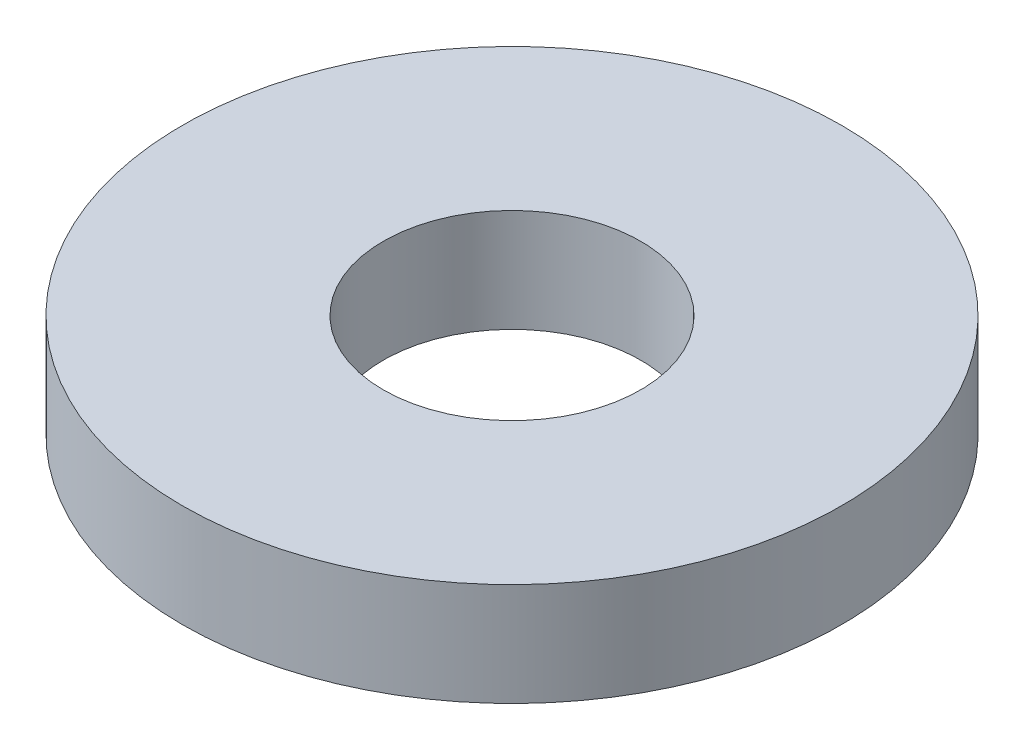
ISO-10303-21;
HEADER;
FILE_DESCRIPTION(('STEP AP214'),'2;1');
FILE_NAME('part.step','',(''),(''),'','','');
FILE_SCHEMA(('AUTOMOTIVE_DESIGN { 1 0 10303 214 1 1 1 1 }'));
ENDSEC;
DATA;
#1=APPLICATION_CONTEXT('core data for automotive mechanical design processes');
#2=APPLICATION_PROTOCOL_DEFINITION('international standard','automotive_design',2000,#1);
#3=PRODUCT_CONTEXT('',#1,'mechanical');
#4=PRODUCT('Part','Part','',(#3));
#5=PRODUCT_RELATED_PRODUCT_CATEGORY('part','',(#4));
#6=PRODUCT_DEFINITION_FORMATION('','',#4);
#7=PRODUCT_DEFINITION_CONTEXT('part definition',#1,'design');
#8=PRODUCT_DEFINITION('design','',#6,#7);
#9=PRODUCT_DEFINITION_SHAPE('','',#8);
#10=(LENGTH_UNIT() NAMED_UNIT(*) SI_UNIT(.MILLI.,.METRE.));
#11=(NAMED_UNIT(*) PLANE_ANGLE_UNIT() SI_UNIT($,.RADIAN.));
#12=(NAMED_UNIT(*) SI_UNIT($,.STERADIAN.) SOLID_ANGLE_UNIT());
#13=UNCERTAINTY_MEASURE_WITH_UNIT(LENGTH_MEASURE(1.E-05),#10,'distance_accuracy_value','');
#14=(GEOMETRIC_REPRESENTATION_CONTEXT(3) GLOBAL_UNCERTAINTY_ASSIGNED_CONTEXT((#13)) GLOBAL_UNIT_ASSIGNED_CONTEXT((#10,
#11,#12)) REPRESENTATION_CONTEXT('',''));
#15=CARTESIAN_POINT('',(0.,0.,0.));
#16=DIRECTION('',(0.,0.,1.));
#17=DIRECTION('',(1.,0.,0.));
#18=AXIS2_PLACEMENT_3D('',#15,#16,#17);
#19=CARTESIAN_POINT('',(0.,2.54,0.));
#20=DIRECTION('',(0.,1.,0.));
#21=DIRECTION('',(0.,0.,1.));
#22=AXIS2_PLACEMENT_3D('',#19,#20,#21);
#23=PLANE('',#22);
#24=CARTESIAN_POINT('',(0.,2.54,0.));
#25=DIRECTION('',(0.,1.,0.));
#26=DIRECTION('',(0.,0.,1.));
#27=AXIS2_PLACEMENT_3D('',#24,#25,#26);
#28=CIRCLE('',#27,8.128);
#29=CARTESIAN_POINT('',(0.,2.54,8.128));
#30=VERTEX_POINT('',#29);
#31=EDGE_CURVE('E10',#30,#30,#28,.T.);
#32=ORIENTED_EDGE('',*,*,#31,.T.);
#33=EDGE_LOOP('',(#32));
#34=FACE_BOUND('',#33,.T.);
#35=CARTESIAN_POINT('',(0.,2.54,0.));
#36=DIRECTION('',(0.,1.,0.));
#37=DIRECTION('',(0.,0.,1.));
#38=AXIS2_PLACEMENT_3D('',#35,#36,#37);
#39=CIRCLE('',#38,3.175);
#40=CARTESIAN_POINT('',(0.,2.54,3.175));
#41=VERTEX_POINT('',#40);
#42=EDGE_CURVE('E48',#41,#41,#39,.T.);
#43=ORIENTED_EDGE('',*,*,#42,.F.);
#44=EDGE_LOOP('',(#43));
#45=FACE_BOUND('',#44,.T.);
#46=ADVANCED_FACE('F35',(#34,#45),#23,.T.);
#47=CARTESIAN_POINT('',(0.,0.,0.));
#48=DIRECTION('',(0.,1.,0.));
#49=DIRECTION('',(0.,0.,1.));
#50=AXIS2_PLACEMENT_3D('',#47,#48,#49);
#51=PLANE('',#50);
#52=CARTESIAN_POINT('',(0.,0.,0.));
#53=DIRECTION('',(0.,1.,0.));
#54=DIRECTION('',(0.,0.,1.));
#55=AXIS2_PLACEMENT_3D('',#52,#53,#54);
#56=CIRCLE('',#55,8.128);
#57=CARTESIAN_POINT('',(0.,0.,8.128));
#58=VERTEX_POINT('',#57);
#59=EDGE_CURVE('E39',#58,#58,#56,.T.);
#60=ORIENTED_EDGE('',*,*,#59,.F.);
#61=EDGE_LOOP('',(#60));
#62=FACE_BOUND('',#61,.T.);
#63=CARTESIAN_POINT('',(0.,0.,0.));
#64=DIRECTION('',(0.,1.,0.));
#65=DIRECTION('',(0.,0.,1.));
#66=AXIS2_PLACEMENT_3D('',#63,#64,#65);
#67=CIRCLE('',#66,3.175);
#68=CARTESIAN_POINT('',(0.,0.,3.175));
#69=VERTEX_POINT('',#68);
#70=EDGE_CURVE('E50',#69,#69,#67,.T.);
#71=ORIENTED_EDGE('',*,*,#70,.T.);
#72=EDGE_LOOP('',(#71));
#73=FACE_BOUND('',#72,.T.);
#74=ADVANCED_FACE('F62',(#62,#73),#51,.F.);
#75=CARTESIAN_POINT('',(0.,2.54,0.));
#76=DIRECTION('',(0.,-1.,0.));
#77=DIRECTION('',(0.,0.,-1.));
#78=AXIS2_PLACEMENT_3D('',#75,#76,#77);
#79=CYLINDRICAL_SURFACE('',#78,8.128);
#80=ORIENTED_EDGE('',*,*,#31,.F.);
#81=EDGE_LOOP('',(#80));
#82=FACE_BOUND('',#81,.T.);
#83=ORIENTED_EDGE('',*,*,#59,.T.);
#84=EDGE_LOOP('',(#83));
#85=FACE_BOUND('',#84,.T.);
#86=ADVANCED_FACE('F37',(#82,#85),#79,.T.);
#87=CARTESIAN_POINT('',(0.,2.54,0.));
#88=DIRECTION('',(0.,-1.,0.));
#89=DIRECTION('',(0.,0.,-1.));
#90=AXIS2_PLACEMENT_3D('',#87,#88,#89);
#91=CYLINDRICAL_SURFACE('',#90,3.175);
#92=ORIENTED_EDGE('',*,*,#42,.T.);
#93=EDGE_LOOP('',(#92));
#94=FACE_BOUND('',#93,.T.);
#95=ORIENTED_EDGE('',*,*,#70,.F.);
#96=EDGE_LOOP('',(#95));
#97=FACE_BOUND('',#96,.T.);
#98=ADVANCED_FACE('F58',(#94,#97),#91,.F.);
#99=CLOSED_SHELL('',(#46,#74,#86,#98));
#100=MANIFOLD_SOLID_BREP('B2',#99);
#101=ADVANCED_BREP_SHAPE_REPRESENTATION('',(#18,#100),#14);
#102=SHAPE_DEFINITION_REPRESENTATION(#9,#101);
ENDSEC;
END-ISO-10303-21;
